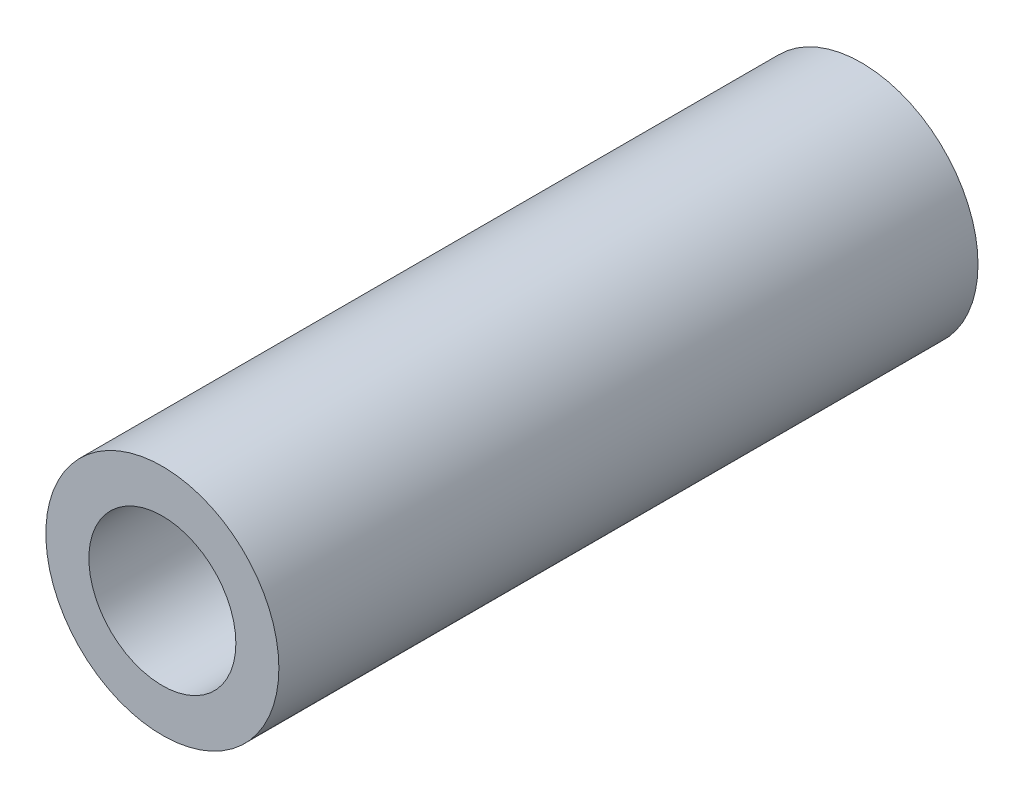
ISO-10303-21;
HEADER;
FILE_DESCRIPTION(('STEP AP214'),'2;1');
FILE_NAME('part.step','',(''),(''),'','','');
FILE_SCHEMA(('AUTOMOTIVE_DESIGN { 1 0 10303 214 1 1 1 1 }'));
ENDSEC;
DATA;
#1=APPLICATION_CONTEXT('core data for automotive mechanical design processes');
#2=APPLICATION_PROTOCOL_DEFINITION('international standard','automotive_design',2000,#1);
#3=PRODUCT_CONTEXT('',#1,'mechanical');
#4=PRODUCT('Part','Part','',(#3));
#5=PRODUCT_RELATED_PRODUCT_CATEGORY('part','',(#4));
#6=PRODUCT_DEFINITION_FORMATION('','',#4);
#7=PRODUCT_DEFINITION_CONTEXT('part definition',#1,'design');
#8=PRODUCT_DEFINITION('design','',#6,#7);
#9=PRODUCT_DEFINITION_SHAPE('','',#8);
#10=(LENGTH_UNIT() NAMED_UNIT(*) SI_UNIT(.MILLI.,.METRE.));
#11=(NAMED_UNIT(*) PLANE_ANGLE_UNIT() SI_UNIT($,.RADIAN.));
#12=(NAMED_UNIT(*) SI_UNIT($,.STERADIAN.) SOLID_ANGLE_UNIT());
#13=UNCERTAINTY_MEASURE_WITH_UNIT(LENGTH_MEASURE(1.E-05),#10,'distance_accuracy_value','');
#14=(GEOMETRIC_REPRESENTATION_CONTEXT(3) GLOBAL_UNCERTAINTY_ASSIGNED_CONTEXT((#13)) GLOBAL_UNIT_ASSIGNED_CONTEXT((#10,
#11,#12)) REPRESENTATION_CONTEXT('',''));
#15=CARTESIAN_POINT('',(0.,0.,0.));
#16=DIRECTION('',(0.,0.,1.));
#17=DIRECTION('',(1.,0.,0.));
#18=AXIS2_PLACEMENT_3D('',#15,#16,#17);
#19=CARTESIAN_POINT('',(0.,0.,19.5));
#20=DIRECTION('',(0.,0.,1.));
#21=DIRECTION('',(1.,0.,0.));
#22=AXIS2_PLACEMENT_3D('',#19,#20,#21);
#23=PLANE('',#22);
#24=CARTESIAN_POINT('',(0.,0.,19.5));
#25=DIRECTION('',(0.,0.,1.));
#26=DIRECTION('',(1.,0.,0.));
#27=AXIS2_PLACEMENT_3D('',#24,#25,#26);
#28=CIRCLE('',#27,3.25);
#29=CARTESIAN_POINT('',(3.25,0.,19.5));
#30=VERTEX_POINT('',#29);
#31=EDGE_CURVE('E10',#30,#30,#28,.T.);
#32=ORIENTED_EDGE('',*,*,#31,.T.);
#33=EDGE_LOOP('',(#32));
#34=FACE_BOUND('',#33,.T.);
#35=CARTESIAN_POINT('',(0.,0.,19.5));
#36=DIRECTION('',(0.,0.,1.));
#37=DIRECTION('',(1.,0.,0.));
#38=AXIS2_PLACEMENT_3D('',#35,#36,#37);
#39=CIRCLE('',#38,2.05);
#40=CARTESIAN_POINT('',(2.05,0.,19.5));
#41=VERTEX_POINT('',#40);
#42=EDGE_CURVE('E56',#41,#41,#39,.T.);
#43=ORIENTED_EDGE('',*,*,#42,.F.);
#44=EDGE_LOOP('',(#43));
#45=FACE_BOUND('',#44,.T.);
#46=ADVANCED_FACE('F43',(#34,#45),#23,.T.);
#47=CARTESIAN_POINT('',(0.,0.,0.));
#48=DIRECTION('',(0.,0.,1.));
#49=DIRECTION('',(1.,0.,0.));
#50=AXIS2_PLACEMENT_3D('',#47,#48,#49);
#51=PLANE('',#50);
#52=CARTESIAN_POINT('',(0.,0.,0.));
#53=DIRECTION('',(0.,0.,1.));
#54=DIRECTION('',(1.,0.,0.));
#55=AXIS2_PLACEMENT_3D('',#52,#53,#54);
#56=CIRCLE('',#55,3.25);
#57=CARTESIAN_POINT('',(3.25,0.,0.));
#58=VERTEX_POINT('',#57);
#59=EDGE_CURVE('E47',#58,#58,#56,.T.);
#60=ORIENTED_EDGE('',*,*,#59,.F.);
#61=EDGE_LOOP('',(#60));
#62=FACE_BOUND('',#61,.T.);
#63=CARTESIAN_POINT('',(0.,0.,0.));
#64=DIRECTION('',(0.,0.,1.));
#65=DIRECTION('',(1.,0.,0.));
#66=AXIS2_PLACEMENT_3D('',#63,#64,#65);
#67=CIRCLE('',#66,2.05);
#68=CARTESIAN_POINT('',(2.05,0.,0.));
#69=VERTEX_POINT('',#68);
#70=EDGE_CURVE('E58',#69,#69,#67,.T.);
#71=ORIENTED_EDGE('',*,*,#70,.T.);
#72=EDGE_LOOP('',(#71));
#73=FACE_BOUND('',#72,.T.);
#74=ADVANCED_FACE('F70',(#62,#73),#51,.F.);
#75=CARTESIAN_POINT('',(0.,0.,19.5));
#76=DIRECTION('',(0.,0.,-1.));
#77=DIRECTION('',(-1.,0.,0.));
#78=AXIS2_PLACEMENT_3D('',#75,#76,#77);
#79=CYLINDRICAL_SURFACE('',#78,3.25);
#80=ORIENTED_EDGE('',*,*,#31,.F.);
#81=EDGE_LOOP('',(#80));
#82=FACE_BOUND('',#81,.T.);
#83=ORIENTED_EDGE('',*,*,#59,.T.);
#84=EDGE_LOOP('',(#83));
#85=FACE_BOUND('',#84,.T.);
#86=ADVANCED_FACE('F45',(#82,#85),#79,.T.);
#87=CARTESIAN_POINT('',(0.,0.,19.5));
#88=DIRECTION('',(0.,0.,-1.));
#89=DIRECTION('',(-1.,0.,0.));
#90=AXIS2_PLACEMENT_3D('',#87,#88,#89);
#91=CYLINDRICAL_SURFACE('',#90,2.05);
#92=ORIENTED_EDGE('',*,*,#42,.T.);
#93=EDGE_LOOP('',(#92));
#94=FACE_BOUND('',#93,.T.);
#95=ORIENTED_EDGE('',*,*,#70,.F.);
#96=EDGE_LOOP('',(#95));
#97=FACE_BOUND('',#96,.T.);
#98=ADVANCED_FACE('F66',(#94,#97),#91,.F.);
#99=CLOSED_SHELL('',(#46,#74,#86,#98));
#100=MANIFOLD_SOLID_BREP('B2',#99);
#101=ADVANCED_BREP_SHAPE_REPRESENTATION('',(#18,#100),#14);
#102=SHAPE_DEFINITION_REPRESENTATION(#9,#101);
ENDSEC;
END-ISO-10303-21;
